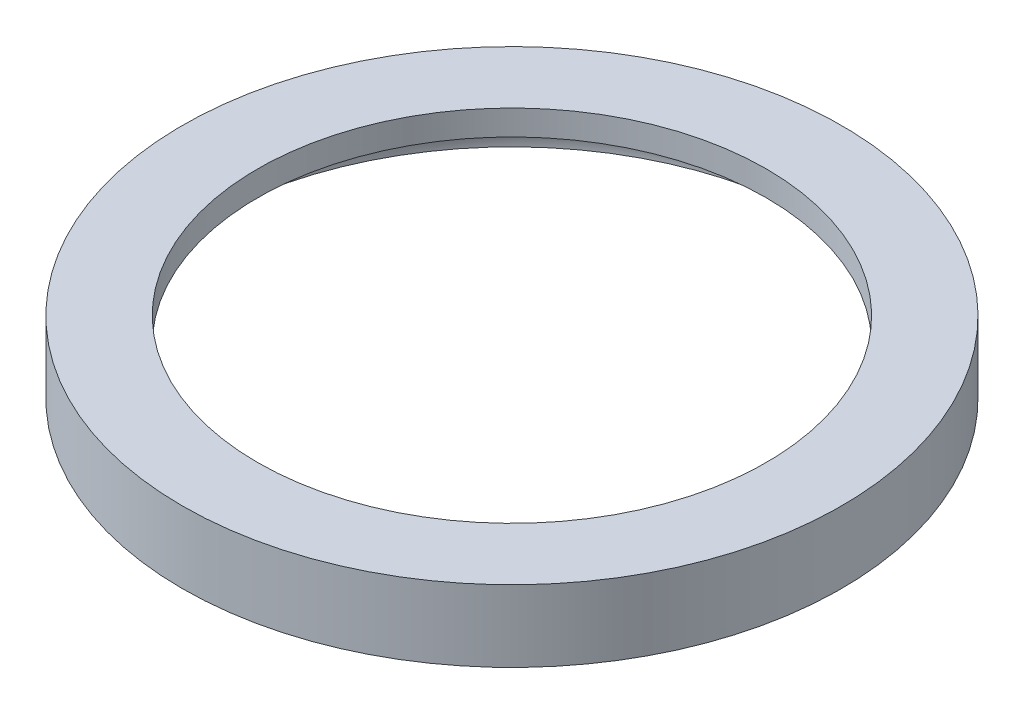
ISO-10303-21;
HEADER;
FILE_DESCRIPTION(('STEP AP214'),'2;1');
FILE_NAME('part.step','',(''),(''),'','','');
FILE_SCHEMA(('AUTOMOTIVE_DESIGN { 1 0 10303 214 1 1 1 1 }'));
ENDSEC;
DATA;
#1=APPLICATION_CONTEXT('core data for automotive mechanical design processes');
#2=APPLICATION_PROTOCOL_DEFINITION('international standard','automotive_design',2000,#1);
#3=PRODUCT_CONTEXT('',#1,'mechanical');
#4=PRODUCT('Part','Part','',(#3));
#5=PRODUCT_RELATED_PRODUCT_CATEGORY('part','',(#4));
#6=PRODUCT_DEFINITION_FORMATION('','',#4);
#7=PRODUCT_DEFINITION_CONTEXT('part definition',#1,'design');
#8=PRODUCT_DEFINITION('design','',#6,#7);
#9=PRODUCT_DEFINITION_SHAPE('','',#8);
#10=(LENGTH_UNIT() NAMED_UNIT(*) SI_UNIT(.MILLI.,.METRE.));
#11=(NAMED_UNIT(*) PLANE_ANGLE_UNIT() SI_UNIT($,.RADIAN.));
#12=(NAMED_UNIT(*) SI_UNIT($,.STERADIAN.) SOLID_ANGLE_UNIT());
#13=UNCERTAINTY_MEASURE_WITH_UNIT(LENGTH_MEASURE(1.E-05),#10,'distance_accuracy_value','');
#14=(GEOMETRIC_REPRESENTATION_CONTEXT(3) GLOBAL_UNCERTAINTY_ASSIGNED_CONTEXT((#13)) GLOBAL_UNIT_ASSIGNED_CONTEXT((#10,
#11,#12)) REPRESENTATION_CONTEXT('',''));
#15=CARTESIAN_POINT('',(0.,0.,0.));
#16=DIRECTION('',(0.,0.,1.));
#17=DIRECTION('',(1.,0.,0.));
#18=AXIS2_PLACEMENT_3D('',#15,#16,#17);
#19=CARTESIAN_POINT('',(0.,9.32617969021743,0.));
#20=DIRECTION('',(0.,1.,0.));
#21=DIRECTION('',(0.,0.,1.));
#22=AXIS2_PLACEMENT_3D('',#19,#20,#21);
#23=CYLINDRICAL_SURFACE('',#22,46.);
#24=CARTESIAN_POINT('',(0.,-5.49333339641002,0.));
#25=DIRECTION('',(0.,1.,0.));
#26=DIRECTION('',(0.,0.,1.));
#27=AXIS2_PLACEMENT_3D('',#24,#25,#26);
#28=CIRCLE('',#27,46.);
#29=CARTESIAN_POINT('',(0.,-5.49333339641002,46.));
#30=VERTEX_POINT('',#29);
#31=EDGE_CURVE('E55',#30,#30,#28,.T.);
#32=ORIENTED_EDGE('',*,*,#31,.T.);
#33=EDGE_LOOP('',(#32));
#34=FACE_BOUND('',#33,.T.);
#35=CARTESIAN_POINT('',(0.,4.50666660358998,0.));
#36=DIRECTION('',(0.,1.,0.));
#37=DIRECTION('',(0.,0.,1.));
#38=AXIS2_PLACEMENT_3D('',#35,#36,#37);
#39=CIRCLE('',#38,46.);
#40=CARTESIAN_POINT('',(0.,4.50666660358998,46.));
#41=VERTEX_POINT('',#40);
#42=EDGE_CURVE('E10',#41,#41,#39,.T.);
#43=ORIENTED_EDGE('',*,*,#42,.F.);
#44=EDGE_LOOP('',(#43));
#45=FACE_BOUND('',#44,.T.);
#46=ADVANCED_FACE('F33',(#34,#45),#23,.T.);
#47=CARTESIAN_POINT('',(0.,4.50666660358998,35.5));
#48=DIRECTION('',(0.,1.,0.));
#49=DIRECTION('',(0.,0.,1.));
#50=AXIS2_PLACEMENT_3D('',#47,#48,#49);
#51=PLANE('',#50);
#52=ORIENTED_EDGE('',*,*,#42,.T.);
#53=EDGE_LOOP('',(#52));
#54=FACE_BOUND('',#53,.T.);
#55=CARTESIAN_POINT('',(0.,4.50666660358998,0.));
#56=DIRECTION('',(0.,1.,0.));
#57=DIRECTION('',(0.,0.,1.));
#58=AXIS2_PLACEMENT_3D('',#55,#56,#57);
#59=CIRCLE('',#58,35.5);
#60=CARTESIAN_POINT('',(0.,4.50666660358998,35.5));
#61=VERTEX_POINT('',#60);
#62=EDGE_CURVE('E39',#61,#61,#59,.T.);
#63=ORIENTED_EDGE('',*,*,#62,.F.);
#64=EDGE_LOOP('',(#63));
#65=FACE_BOUND('',#64,.T.);
#66=ADVANCED_FACE('F73',(#54,#65),#51,.T.);
#67=CARTESIAN_POINT('',(0.,9.32617969021743,0.));
#68=DIRECTION('',(0.,1.,0.));
#69=DIRECTION('',(0.,0.,1.));
#70=AXIS2_PLACEMENT_3D('',#67,#68,#69);
#71=CYLINDRICAL_SURFACE('',#70,35.5);
#72=ORIENTED_EDGE('',*,*,#62,.T.);
#73=EDGE_LOOP('',(#72));
#74=FACE_BOUND('',#73,.T.);
#75=CARTESIAN_POINT('',(0.,1.00666660358998,0.));
#76=DIRECTION('',(0.,1.,0.));
#77=DIRECTION('',(0.,0.,1.));
#78=AXIS2_PLACEMENT_3D('',#75,#76,#77);
#79=CIRCLE('',#78,35.5);
#80=CARTESIAN_POINT('',(0.,1.00666660358998,35.5));
#81=VERTEX_POINT('',#80);
#82=EDGE_CURVE('E43',#81,#81,#79,.T.);
#83=ORIENTED_EDGE('',*,*,#82,.F.);
#84=EDGE_LOOP('',(#83));
#85=FACE_BOUND('',#84,.T.);
#86=ADVANCED_FACE('F77',(#74,#85),#71,.F.);
#87=CARTESIAN_POINT('',(0.,1.00666660358998,36.5));
#88=DIRECTION('',(0.,-1.,0.));
#89=DIRECTION('',(0.,0.,-1.));
#90=AXIS2_PLACEMENT_3D('',#87,#88,#89);
#91=PLANE('',#90);
#92=ORIENTED_EDGE('',*,*,#82,.T.);
#93=EDGE_LOOP('',(#92));
#94=FACE_BOUND('',#93,.T.);
#95=CARTESIAN_POINT('',(0.,1.00666660358998,0.));
#96=DIRECTION('',(0.,1.,0.));
#97=DIRECTION('',(0.,0.,1.));
#98=AXIS2_PLACEMENT_3D('',#95,#96,#97);
#99=CIRCLE('',#98,36.5);
#100=CARTESIAN_POINT('',(0.,1.00666660358998,36.5));
#101=VERTEX_POINT('',#100);
#102=EDGE_CURVE('E47',#101,#101,#99,.T.);
#103=ORIENTED_EDGE('',*,*,#102,.F.);
#104=EDGE_LOOP('',(#103));
#105=FACE_BOUND('',#104,.T.);
#106=ADVANCED_FACE('F69',(#94,#105),#91,.T.);
#107=CARTESIAN_POINT('',(0.,-5.49333339641002,0.));
#108=DIRECTION('',(0.,1.,0.));
#109=DIRECTION('',(0.,0.,1.));
#110=AXIS2_PLACEMENT_3D('',#107,#108,#109);
#111=TOROIDAL_SURFACE('',#110,36.5,6.5);
#112=ORIENTED_EDGE('',*,*,#102,.T.);
#113=EDGE_LOOP('',(#112));
#114=FACE_BOUND('',#113,.T.);
#115=CARTESIAN_POINT('',(0.,-5.49333339641002,0.));
#116=DIRECTION('',(0.,1.,0.));
#117=DIRECTION('',(0.,0.,1.));
#118=AXIS2_PLACEMENT_3D('',#115,#116,#117);
#119=CIRCLE('',#118,43.);
#120=CARTESIAN_POINT('',(0.,-5.49333339641002,43.));
#121=VERTEX_POINT('',#120);
#122=EDGE_CURVE('E52',#121,#121,#119,.T.);
#123=ORIENTED_EDGE('',*,*,#122,.F.);
#124=EDGE_LOOP('',(#123));
#125=FACE_BOUND('',#124,.T.);
#126=ADVANCED_FACE('F63',(#114,#125),#111,.F.);
#127=CARTESIAN_POINT('',(0.,-5.49333339641002,46.));
#128=DIRECTION('',(0.,-1.,0.));
#129=DIRECTION('',(0.,0.,-1.));
#130=AXIS2_PLACEMENT_3D('',#127,#128,#129);
#131=PLANE('',#130);
#132=ORIENTED_EDGE('',*,*,#122,.T.);
#133=EDGE_LOOP('',(#132));
#134=FACE_BOUND('',#133,.T.);
#135=ORIENTED_EDGE('',*,*,#31,.F.);
#136=EDGE_LOOP('',(#135));
#137=FACE_BOUND('',#136,.T.);
#138=ADVANCED_FACE('F61',(#134,#137),#131,.T.);
#139=CLOSED_SHELL('',(#46,#66,#86,#106,#126,#138));
#140=MANIFOLD_SOLID_BREP('B2',#139);
#141=ADVANCED_BREP_SHAPE_REPRESENTATION('',(#18,#140),#14);
#142=SHAPE_DEFINITION_REPRESENTATION(#9,#141);
ENDSEC;
END-ISO-10303-21;
